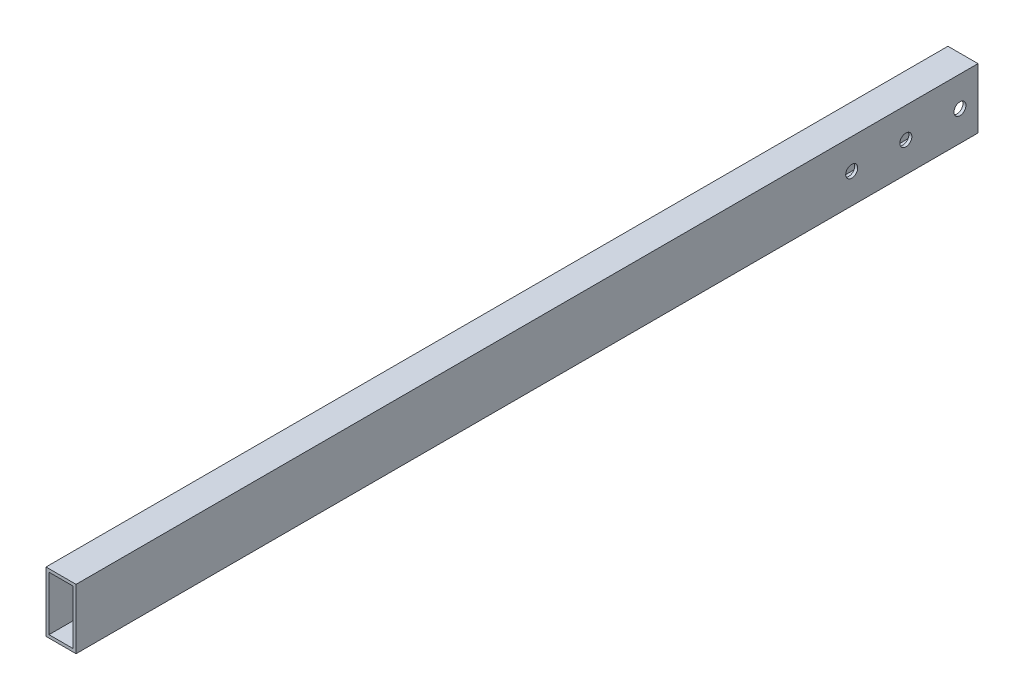
ISO-10303-21;
HEADER;
FILE_DESCRIPTION(('STEP AP214'),'2;1');
FILE_NAME('part.step','',(''),(''),'','','');
FILE_SCHEMA(('AUTOMOTIVE_DESIGN { 1 0 10303 214 1 1 1 1 }'));
ENDSEC;
DATA;
#1=APPLICATION_CONTEXT('core data for automotive mechanical design processes');
#2=APPLICATION_PROTOCOL_DEFINITION('international standard','automotive_design',2000,#1);
#3=PRODUCT_CONTEXT('',#1,'mechanical');
#4=PRODUCT('Part','Part','',(#3));
#5=PRODUCT_RELATED_PRODUCT_CATEGORY('part','',(#4));
#6=PRODUCT_DEFINITION_FORMATION('','',#4);
#7=PRODUCT_DEFINITION_CONTEXT('part definition',#1,'design');
#8=PRODUCT_DEFINITION('design','',#6,#7);
#9=PRODUCT_DEFINITION_SHAPE('','',#8);
#10=(LENGTH_UNIT() NAMED_UNIT(*) SI_UNIT(.MILLI.,.METRE.));
#11=(NAMED_UNIT(*) PLANE_ANGLE_UNIT() SI_UNIT($,.RADIAN.));
#12=(NAMED_UNIT(*) SI_UNIT($,.STERADIAN.) SOLID_ANGLE_UNIT());
#13=UNCERTAINTY_MEASURE_WITH_UNIT(LENGTH_MEASURE(1.E-05),#10,'distance_accuracy_value','');
#14=(GEOMETRIC_REPRESENTATION_CONTEXT(3) GLOBAL_UNCERTAINTY_ASSIGNED_CONTEXT((#13)) GLOBAL_UNIT_ASSIGNED_CONTEXT((#10,
#11,#12)) REPRESENTATION_CONTEXT('',''));
#15=CARTESIAN_POINT('',(0.,0.,0.));
#16=DIRECTION('',(0.,0.,1.));
#17=DIRECTION('',(1.,0.,0.));
#18=AXIS2_PLACEMENT_3D('',#15,#16,#17);
#19=CARTESIAN_POINT('',(0.,0.,300.));
#20=DIRECTION('',(0.,0.,-1.));
#21=DIRECTION('',(-1.,0.,0.));
#22=AXIS2_PLACEMENT_3D('',#19,#20,#21);
#23=PLANE('',#22);
#24=DIRECTION('',(0.,1.,0.));
#25=VECTOR('',#24,1.);
#26=CARTESIAN_POINT('',(5.,-10.,300.));
#27=LINE('',#26,#25);
#28=CARTESIAN_POINT('',(5.,-10.,300.));
#29=VERTEX_POINT('',#28);
#30=CARTESIAN_POINT('',(5.,9.99999999999999,300.));
#31=VERTEX_POINT('',#30);
#32=EDGE_CURVE('E140',#29,#31,#27,.T.);
#33=ORIENTED_EDGE('',*,*,#32,.T.);
#34=DIRECTION('',(-1.,0.,0.));
#35=VECTOR('',#34,1.);
#36=CARTESIAN_POINT('',(-5.,9.99999999999999,300.));
#37=LINE('',#36,#35);
#38=CARTESIAN_POINT('',(-5.,9.99999999999999,300.));
#39=VERTEX_POINT('',#38);
#40=EDGE_CURVE('E143',#31,#39,#37,.T.);
#41=ORIENTED_EDGE('',*,*,#40,.T.);
#42=DIRECTION('',(0.,-1.,0.));
#43=VECTOR('',#42,1.);
#44=CARTESIAN_POINT('',(-5.,-10.,300.));
#45=LINE('',#44,#43);
#46=CARTESIAN_POINT('',(-5.,-10.,300.));
#47=VERTEX_POINT('',#46);
#48=EDGE_CURVE('E146',#39,#47,#45,.T.);
#49=ORIENTED_EDGE('',*,*,#48,.T.);
#50=DIRECTION('',(1.,0.,0.));
#51=VECTOR('',#50,1.);
#52=CARTESIAN_POINT('',(-5.,-10.,300.));
#53=LINE('',#52,#51);
#54=EDGE_CURVE('E148',#47,#29,#53,.T.);
#55=ORIENTED_EDGE('',*,*,#54,.T.);
#56=EDGE_LOOP('',(#33,#41,#49,#55));
#57=FACE_BOUND('',#56,.T.);
#58=DIRECTION('',(0.,-1.,0.));
#59=VECTOR('',#58,1.);
#60=CARTESIAN_POINT('',(-4.,-9.00000000000001,300.));
#61=LINE('',#60,#59);
#62=CARTESIAN_POINT('',(-4.,8.99999999999999,300.));
#63=VERTEX_POINT('',#62);
#64=CARTESIAN_POINT('',(-4.,-9.00000000000001,300.));
#65=VERTEX_POINT('',#64);
#66=EDGE_CURVE('E102',#63,#65,#61,.T.);
#67=ORIENTED_EDGE('',*,*,#66,.F.);
#68=DIRECTION('',(-1.,0.,0.));
#69=VECTOR('',#68,1.);
#70=CARTESIAN_POINT('',(-4.,8.99999999999999,300.));
#71=LINE('',#70,#69);
#72=CARTESIAN_POINT('',(4.,8.99999999999999,300.));
#73=VERTEX_POINT('',#72);
#74=EDGE_CURVE('E124',#73,#63,#71,.T.);
#75=ORIENTED_EDGE('',*,*,#74,.F.);
#76=DIRECTION('',(0.,1.,0.));
#77=VECTOR('',#76,1.);
#78=CARTESIAN_POINT('',(4.,-9.00000000000001,300.));
#79=LINE('',#78,#77);
#80=CARTESIAN_POINT('',(4.,-9.00000000000001,300.));
#81=VERTEX_POINT('',#80);
#82=EDGE_CURVE('E122',#81,#73,#79,.T.);
#83=ORIENTED_EDGE('',*,*,#82,.F.);
#84=DIRECTION('',(1.,0.,0.));
#85=VECTOR('',#84,1.);
#86=CARTESIAN_POINT('',(-4.,-9.00000000000001,300.));
#87=LINE('',#86,#85);
#88=EDGE_CURVE('E110',#65,#81,#87,.T.);
#89=ORIENTED_EDGE('',*,*,#88,.F.);
#90=EDGE_LOOP('',(#67,#75,#83,#89));
#91=FACE_BOUND('',#90,.T.);
#92=ADVANCED_FACE('F37',(#57,#91),#23,.F.);
#93=CARTESIAN_POINT('',(0.,0.,0.));
#94=DIRECTION('',(0.,0.,-1.));
#95=DIRECTION('',(-1.,0.,0.));
#96=AXIS2_PLACEMENT_3D('',#93,#94,#95);
#97=PLANE('',#96);
#98=DIRECTION('',(0.,1.,0.));
#99=VECTOR('',#98,1.);
#100=CARTESIAN_POINT('',(5.,-10.,0.));
#101=LINE('',#100,#99);
#102=CARTESIAN_POINT('',(5.,-10.,0.));
#103=VERTEX_POINT('',#102);
#104=CARTESIAN_POINT('',(5.,9.99999999999999,0.));
#105=VERTEX_POINT('',#104);
#106=EDGE_CURVE('E118',#103,#105,#101,.T.);
#107=ORIENTED_EDGE('',*,*,#106,.F.);
#108=DIRECTION('',(1.,0.,0.));
#109=VECTOR('',#108,1.);
#110=CARTESIAN_POINT('',(-5.,-10.,0.));
#111=LINE('',#110,#109);
#112=CARTESIAN_POINT('',(-5.,-10.,0.));
#113=VERTEX_POINT('',#112);
#114=EDGE_CURVE('E144',#113,#103,#111,.T.);
#115=ORIENTED_EDGE('',*,*,#114,.F.);
#116=DIRECTION('',(0.,-1.,0.));
#117=VECTOR('',#116,1.);
#118=CARTESIAN_POINT('',(-5.,-10.,0.));
#119=LINE('',#118,#117);
#120=CARTESIAN_POINT('',(-5.,9.99999999999999,0.));
#121=VERTEX_POINT('',#120);
#122=EDGE_CURVE('E155',#121,#113,#119,.T.);
#123=ORIENTED_EDGE('',*,*,#122,.F.);
#124=DIRECTION('',(-1.,0.,0.));
#125=VECTOR('',#124,1.);
#126=CARTESIAN_POINT('',(-5.,9.99999999999999,0.));
#127=LINE('',#126,#125);
#128=EDGE_CURVE('E153',#105,#121,#127,.T.);
#129=ORIENTED_EDGE('',*,*,#128,.F.);
#130=EDGE_LOOP('',(#107,#115,#123,#129));
#131=FACE_BOUND('',#130,.T.);
#132=DIRECTION('',(-1.,0.,0.));
#133=VECTOR('',#132,1.);
#134=CARTESIAN_POINT('',(-4.,8.99999999999999,0.));
#135=LINE('',#134,#133);
#136=CARTESIAN_POINT('',(4.,8.99999999999999,0.));
#137=VERTEX_POINT('',#136);
#138=CARTESIAN_POINT('',(-4.,8.99999999999999,0.));
#139=VERTEX_POINT('',#138);
#140=EDGE_CURVE('E111',#137,#139,#135,.T.);
#141=ORIENTED_EDGE('',*,*,#140,.T.);
#142=DIRECTION('',(0.,-1.,0.));
#143=VECTOR('',#142,1.);
#144=CARTESIAN_POINT('',(-4.,-9.00000000000001,0.));
#145=LINE('',#144,#143);
#146=CARTESIAN_POINT('',(-4.,-9.00000000000001,0.));
#147=VERTEX_POINT('',#146);
#148=EDGE_CURVE('E60',#139,#147,#145,.T.);
#149=ORIENTED_EDGE('',*,*,#148,.T.);
#150=DIRECTION('',(1.,0.,0.));
#151=VECTOR('',#150,1.);
#152=CARTESIAN_POINT('',(-4.,-9.00000000000001,0.));
#153=LINE('',#152,#151);
#154=CARTESIAN_POINT('',(4.,-9.00000000000001,0.));
#155=VERTEX_POINT('',#154);
#156=EDGE_CURVE('E117',#147,#155,#153,.T.);
#157=ORIENTED_EDGE('',*,*,#156,.T.);
#158=DIRECTION('',(0.,1.,0.));
#159=VECTOR('',#158,1.);
#160=CARTESIAN_POINT('',(4.,-9.00000000000001,0.));
#161=LINE('',#160,#159);
#162=EDGE_CURVE('E132',#155,#137,#161,.T.);
#163=ORIENTED_EDGE('',*,*,#162,.T.);
#164=EDGE_LOOP('',(#141,#149,#157,#163));
#165=FACE_BOUND('',#164,.T.);
#166=ADVANCED_FACE('F173',(#131,#165),#97,.T.);
#167=CARTESIAN_POINT('',(5.,-10.,300.));
#168=DIRECTION('',(-1.,0.,0.));
#169=DIRECTION('',(0.,0.,1.));
#170=AXIS2_PLACEMENT_3D('',#167,#168,#169);
#171=PLANE('',#170);
#172=CARTESIAN_POINT('',(5.,0.,6.));
#173=DIRECTION('',(1.,0.,0.));
#174=DIRECTION('',(0.,0.,-1.));
#175=AXIS2_PLACEMENT_3D('',#172,#173,#174);
#176=CIRCLE('',#175,2.);
#177=CARTESIAN_POINT('',(5.,0.,4.));
#178=VERTEX_POINT('',#177);
#179=EDGE_CURVE('E130',#178,#178,#176,.T.);
#180=ORIENTED_EDGE('',*,*,#179,.F.);
#181=EDGE_LOOP('',(#180));
#182=FACE_BOUND('',#181,.T.);
#183=CARTESIAN_POINT('',(5.,0.,24.));
#184=DIRECTION('',(1.,0.,0.));
#185=DIRECTION('',(0.,0.,-1.));
#186=AXIS2_PLACEMENT_3D('',#183,#184,#185);
#187=CIRCLE('',#186,2.);
#188=CARTESIAN_POINT('',(5.,0.,22.));
#189=VERTEX_POINT('',#188);
#190=EDGE_CURVE('E242',#189,#189,#187,.T.);
#191=ORIENTED_EDGE('',*,*,#190,.F.);
#192=EDGE_LOOP('',(#191));
#193=FACE_BOUND('',#192,.T.);
#194=CARTESIAN_POINT('',(5.,0.,42.));
#195=DIRECTION('',(1.,0.,0.));
#196=DIRECTION('',(0.,0.,-1.));
#197=AXIS2_PLACEMENT_3D('',#194,#195,#196);
#198=CIRCLE('',#197,2.);
#199=CARTESIAN_POINT('',(5.,0.,40.));
#200=VERTEX_POINT('',#199);
#201=EDGE_CURVE('E247',#200,#200,#198,.T.);
#202=ORIENTED_EDGE('',*,*,#201,.F.);
#203=EDGE_LOOP('',(#202));
#204=FACE_BOUND('',#203,.T.);
#205=ORIENTED_EDGE('',*,*,#106,.T.);
#206=DIRECTION('',(0.,0.,-1.));
#207=VECTOR('',#206,1.);
#208=CARTESIAN_POINT('',(5.,9.99999999999999,300.));
#209=LINE('',#208,#207);
#210=EDGE_CURVE('E11',#31,#105,#209,.T.);
#211=ORIENTED_EDGE('',*,*,#210,.F.);
#212=ORIENTED_EDGE('',*,*,#32,.F.);
#213=DIRECTION('',(0.,0.,-1.));
#214=VECTOR('',#213,1.);
#215=CARTESIAN_POINT('',(5.,-10.,300.));
#216=LINE('',#215,#214);
#217=EDGE_CURVE('E150',#29,#103,#216,.T.);
#218=ORIENTED_EDGE('',*,*,#217,.T.);
#219=EDGE_LOOP('',(#205,#211,#212,#218));
#220=FACE_BOUND('',#219,.T.);
#221=ADVANCED_FACE('F39',(#182,#193,#204,#220),#171,.F.);
#222=CARTESIAN_POINT('',(-5.,9.99999999999999,300.));
#223=DIRECTION('',(0.,-1.,0.));
#224=DIRECTION('',(0.,0.,-1.));
#225=AXIS2_PLACEMENT_3D('',#222,#223,#224);
#226=PLANE('',#225);
#227=ORIENTED_EDGE('',*,*,#128,.T.);
#228=DIRECTION('',(0.,0.,-1.));
#229=VECTOR('',#228,1.);
#230=CARTESIAN_POINT('',(-5.,9.99999999999999,300.));
#231=LINE('',#230,#229);
#232=EDGE_CURVE('E45',#39,#121,#231,.T.);
#233=ORIENTED_EDGE('',*,*,#232,.F.);
#234=ORIENTED_EDGE('',*,*,#40,.F.);
#235=ORIENTED_EDGE('',*,*,#210,.T.);
#236=EDGE_LOOP('',(#227,#233,#234,#235));
#237=FACE_BOUND('',#236,.T.);
#238=ADVANCED_FACE('F183',(#237),#226,.F.);
#239=CARTESIAN_POINT('',(-5.,-10.,300.));
#240=DIRECTION('',(1.,0.,0.));
#241=DIRECTION('',(0.,0.,-1.));
#242=AXIS2_PLACEMENT_3D('',#239,#240,#241);
#243=PLANE('',#242);
#244=ORIENTED_EDGE('',*,*,#122,.T.);
#245=DIRECTION('',(0.,0.,-1.));
#246=VECTOR('',#245,1.);
#247=CARTESIAN_POINT('',(-5.,-10.,300.));
#248=LINE('',#247,#246);
#249=EDGE_CURVE('E160',#47,#113,#248,.T.);
#250=ORIENTED_EDGE('',*,*,#249,.F.);
#251=ORIENTED_EDGE('',*,*,#48,.F.);
#252=ORIENTED_EDGE('',*,*,#232,.T.);
#253=EDGE_LOOP('',(#244,#250,#251,#252));
#254=FACE_BOUND('',#253,.T.);
#255=ADVANCED_FACE('F167',(#254),#243,.F.);
#256=CARTESIAN_POINT('',(-5.,-10.,300.));
#257=DIRECTION('',(0.,1.,0.));
#258=DIRECTION('',(0.,0.,1.));
#259=AXIS2_PLACEMENT_3D('',#256,#257,#258);
#260=PLANE('',#259);
#261=ORIENTED_EDGE('',*,*,#114,.T.);
#262=ORIENTED_EDGE('',*,*,#217,.F.);
#263=ORIENTED_EDGE('',*,*,#54,.F.);
#264=ORIENTED_EDGE('',*,*,#249,.T.);
#265=EDGE_LOOP('',(#261,#262,#263,#264));
#266=FACE_BOUND('',#265,.T.);
#267=ADVANCED_FACE('F177',(#266),#260,.F.);
#268=CARTESIAN_POINT('',(-4.,-9.00000000000001,300.));
#269=DIRECTION('',(1.,0.,0.));
#270=DIRECTION('',(0.,0.,-1.));
#271=AXIS2_PLACEMENT_3D('',#268,#269,#270);
#272=PLANE('',#271);
#273=ORIENTED_EDGE('',*,*,#148,.F.);
#274=DIRECTION('',(0.,0.,-1.));
#275=VECTOR('',#274,1.);
#276=CARTESIAN_POINT('',(-4.,8.99999999999999,300.));
#277=LINE('',#276,#275);
#278=EDGE_CURVE('E106',#63,#139,#277,.T.);
#279=ORIENTED_EDGE('',*,*,#278,.F.);
#280=ORIENTED_EDGE('',*,*,#66,.T.);
#281=DIRECTION('',(0.,0.,-1.));
#282=VECTOR('',#281,1.);
#283=CARTESIAN_POINT('',(-4.,-9.00000000000001,300.));
#284=LINE('',#283,#282);
#285=EDGE_CURVE('E105',#65,#147,#284,.T.);
#286=ORIENTED_EDGE('',*,*,#285,.T.);
#287=EDGE_LOOP('',(#273,#279,#280,#286));
#288=FACE_BOUND('',#287,.T.);
#289=ADVANCED_FACE('F104',(#288),#272,.T.);
#290=CARTESIAN_POINT('',(-4.,-9.00000000000001,300.));
#291=DIRECTION('',(0.,1.,0.));
#292=DIRECTION('',(0.,0.,1.));
#293=AXIS2_PLACEMENT_3D('',#290,#291,#292);
#294=PLANE('',#293);
#295=ORIENTED_EDGE('',*,*,#156,.F.);
#296=ORIENTED_EDGE('',*,*,#285,.F.);
#297=ORIENTED_EDGE('',*,*,#88,.T.);
#298=DIRECTION('',(0.,0.,-1.));
#299=VECTOR('',#298,1.);
#300=CARTESIAN_POINT('',(4.,-9.00000000000001,300.));
#301=LINE('',#300,#299);
#302=EDGE_CURVE('E119',#81,#155,#301,.T.);
#303=ORIENTED_EDGE('',*,*,#302,.T.);
#304=EDGE_LOOP('',(#295,#296,#297,#303));
#305=FACE_BOUND('',#304,.T.);
#306=ADVANCED_FACE('F114',(#305),#294,.T.);
#307=CARTESIAN_POINT('',(4.,-9.00000000000001,300.));
#308=DIRECTION('',(-1.,0.,0.));
#309=DIRECTION('',(0.,-1.,0.));
#310=AXIS2_PLACEMENT_3D('',#307,#308,#309);
#311=PLANE('',#310);
#312=CARTESIAN_POINT('',(4.,0.,6.));
#313=DIRECTION('',(-1.,0.,0.));
#314=DIRECTION('',(0.,-1.,0.));
#315=AXIS2_PLACEMENT_3D('',#312,#313,#314);
#316=CIRCLE('',#315,2.);
#317=CARTESIAN_POINT('',(4.,-2.,6.));
#318=VERTEX_POINT('',#317);
#319=EDGE_CURVE('E233',#318,#318,#316,.F.);
#320=ORIENTED_EDGE('',*,*,#319,.T.);
#321=EDGE_LOOP('',(#320));
#322=FACE_BOUND('',#321,.T.);
#323=CARTESIAN_POINT('',(4.,0.,24.));
#324=DIRECTION('',(-1.,0.,0.));
#325=DIRECTION('',(0.,-1.,0.));
#326=AXIS2_PLACEMENT_3D('',#323,#324,#325);
#327=CIRCLE('',#326,2.);
#328=CARTESIAN_POINT('',(4.,-2.00000000000001,24.));
#329=VERTEX_POINT('',#328);
#330=EDGE_CURVE('E237',#329,#329,#327,.F.);
#331=ORIENTED_EDGE('',*,*,#330,.T.);
#332=EDGE_LOOP('',(#331));
#333=FACE_BOUND('',#332,.T.);
#334=CARTESIAN_POINT('',(4.,0.,42.));
#335=DIRECTION('',(-1.,0.,0.));
#336=DIRECTION('',(0.,-1.,0.));
#337=AXIS2_PLACEMENT_3D('',#334,#335,#336);
#338=CIRCLE('',#337,2.);
#339=CARTESIAN_POINT('',(4.,-2.,42.));
#340=VERTEX_POINT('',#339);
#341=EDGE_CURVE('E245',#340,#340,#338,.F.);
#342=ORIENTED_EDGE('',*,*,#341,.T.);
#343=EDGE_LOOP('',(#342));
#344=FACE_BOUND('',#343,.T.);
#345=ORIENTED_EDGE('',*,*,#162,.F.);
#346=ORIENTED_EDGE('',*,*,#302,.F.);
#347=ORIENTED_EDGE('',*,*,#82,.T.);
#348=DIRECTION('',(0.,0.,-1.));
#349=VECTOR('',#348,1.);
#350=CARTESIAN_POINT('',(4.,8.99999999999999,300.));
#351=LINE('',#350,#349);
#352=EDGE_CURVE('E52',#73,#137,#351,.T.);
#353=ORIENTED_EDGE('',*,*,#352,.T.);
#354=EDGE_LOOP('',(#345,#346,#347,#353));
#355=FACE_BOUND('',#354,.T.);
#356=ADVANCED_FACE('F207',(#322,#333,#344,#355),#311,.T.);
#357=CARTESIAN_POINT('',(-4.,8.99999999999999,300.));
#358=DIRECTION('',(0.,-1.,0.));
#359=DIRECTION('',(0.,0.,-1.));
#360=AXIS2_PLACEMENT_3D('',#357,#358,#359);
#361=PLANE('',#360);
#362=ORIENTED_EDGE('',*,*,#140,.F.);
#363=ORIENTED_EDGE('',*,*,#352,.F.);
#364=ORIENTED_EDGE('',*,*,#74,.T.);
#365=ORIENTED_EDGE('',*,*,#278,.T.);
#366=EDGE_LOOP('',(#362,#363,#364,#365));
#367=FACE_BOUND('',#366,.T.);
#368=ADVANCED_FACE('F211',(#367),#361,.T.);
#369=CARTESIAN_POINT('',(-5.001,0.,42.));
#370=DIRECTION('',(1.,0.,0.));
#371=DIRECTION('',(0.,0.,-1.));
#372=AXIS2_PLACEMENT_3D('',#369,#370,#371);
#373=CYLINDRICAL_SURFACE('',#372,2.);
#374=ORIENTED_EDGE('',*,*,#341,.F.);
#375=EDGE_LOOP('',(#374));
#376=FACE_BOUND('',#375,.T.);
#377=ORIENTED_EDGE('',*,*,#201,.T.);
#378=EDGE_LOOP('',(#377));
#379=FACE_BOUND('',#378,.T.);
#380=ADVANCED_FACE('F217',(#376,#379),#373,.F.);
#381=CARTESIAN_POINT('',(-5.001,0.,24.));
#382=DIRECTION('',(1.,0.,0.));
#383=DIRECTION('',(0.,0.,-1.));
#384=AXIS2_PLACEMENT_3D('',#381,#382,#383);
#385=CYLINDRICAL_SURFACE('',#384,2.);
#386=ORIENTED_EDGE('',*,*,#330,.F.);
#387=EDGE_LOOP('',(#386));
#388=FACE_BOUND('',#387,.T.);
#389=ORIENTED_EDGE('',*,*,#190,.T.);
#390=EDGE_LOOP('',(#389));
#391=FACE_BOUND('',#390,.T.);
#392=ADVANCED_FACE('F220',(#388,#391),#385,.F.);
#393=CARTESIAN_POINT('',(-5.001,0.,6.));
#394=DIRECTION('',(1.,0.,0.));
#395=DIRECTION('',(0.,0.,-1.));
#396=AXIS2_PLACEMENT_3D('',#393,#394,#395);
#397=CYLINDRICAL_SURFACE('',#396,2.);
#398=ORIENTED_EDGE('',*,*,#319,.F.);
#399=EDGE_LOOP('',(#398));
#400=FACE_BOUND('',#399,.T.);
#401=ORIENTED_EDGE('',*,*,#179,.T.);
#402=EDGE_LOOP('',(#401));
#403=FACE_BOUND('',#402,.T.);
#404=ADVANCED_FACE('F224',(#400,#403),#397,.F.);
#405=CLOSED_SHELL('',(#92,#166,#221,#238,#255,#267,#289,#306,#356,#368,#380,#392,#404));
#406=MANIFOLD_SOLID_BREP('B2',#405);
#407=ADVANCED_BREP_SHAPE_REPRESENTATION('',(#18,#406),#14);
#408=SHAPE_DEFINITION_REPRESENTATION(#9,#407);
ENDSEC;
END-ISO-10303-21;
